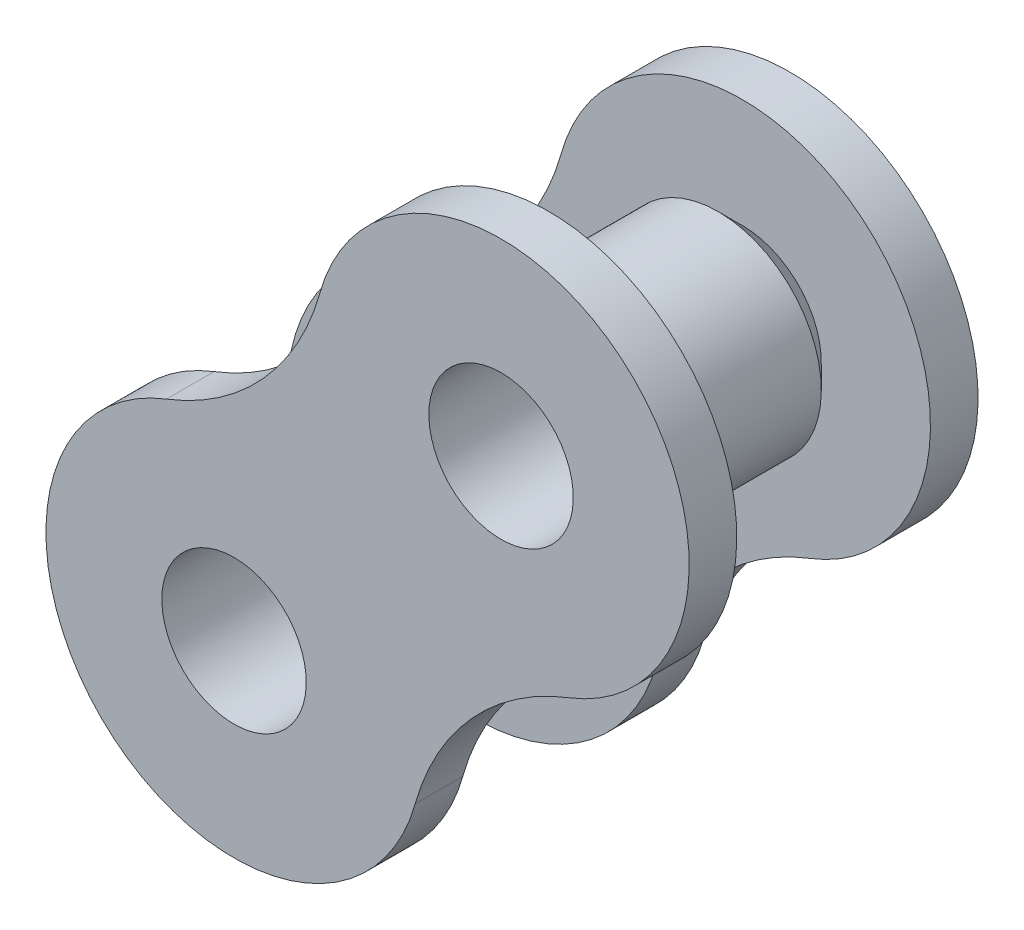
ISO-10303-21;
HEADER;
FILE_DESCRIPTION(('STEP AP214'),'2;1');
FILE_NAME('part.step','',(''),(''),'','','');
FILE_SCHEMA(('AUTOMOTIVE_DESIGN { 1 0 10303 214 1 1 1 1 }'));
ENDSEC;
DATA;
#1=APPLICATION_CONTEXT('core data for automotive mechanical design processes');
#2=APPLICATION_PROTOCOL_DEFINITION('international standard','automotive_design',2000,#1);
#3=PRODUCT_CONTEXT('',#1,'mechanical');
#4=PRODUCT('Part','Part','',(#3));
#5=PRODUCT_RELATED_PRODUCT_CATEGORY('part','',(#4));
#6=PRODUCT_DEFINITION_FORMATION('','',#4);
#7=PRODUCT_DEFINITION_CONTEXT('part definition',#1,'design');
#8=PRODUCT_DEFINITION('design','',#6,#7);
#9=PRODUCT_DEFINITION_SHAPE('','',#8);
#10=(LENGTH_UNIT() NAMED_UNIT(*) SI_UNIT(.MILLI.,.METRE.));
#11=(NAMED_UNIT(*) PLANE_ANGLE_UNIT() SI_UNIT($,.RADIAN.));
#12=(NAMED_UNIT(*) SI_UNIT($,.STERADIAN.) SOLID_ANGLE_UNIT());
#13=UNCERTAINTY_MEASURE_WITH_UNIT(LENGTH_MEASURE(1.E-05),#10,'distance_accuracy_value','');
#14=(GEOMETRIC_REPRESENTATION_CONTEXT(3) GLOBAL_UNCERTAINTY_ASSIGNED_CONTEXT((#13)) GLOBAL_UNIT_ASSIGNED_CONTEXT((#10,
#11,#12)) REPRESENTATION_CONTEXT('',''));
#15=CARTESIAN_POINT('',(0.,0.,0.));
#16=DIRECTION('',(0.,0.,1.));
#17=DIRECTION('',(1.,0.,0.));
#18=AXIS2_PLACEMENT_3D('',#15,#16,#17);
#19=CARTESIAN_POINT('',(89.4881503249085,918.494208741523,-128.5494));
#20=DIRECTION('',(0.,0.,-1.));
#21=DIRECTION('',(0.,-1.,0.));
#22=AXIS2_PLACEMENT_3D('',#19,#20,#21);
#23=PLANE('',#22);
#24=CARTESIAN_POINT('',(87.3517540658685,916.145499303479,-128.5494));
#25=DIRECTION('',(0.,0.,1.));
#26=DIRECTION('',(0.672880711508676,0.73975100410853,0.));
#27=AXIS2_PLACEMENT_3D('',#24,#25,#26);
#28=CIRCLE('',#27,3.0099);
#29=CARTESIAN_POINT('',(86.2709440464581,918.954653573351,-128.5494));
#30=VERTEX_POINT('',#29);
#31=CARTESIAN_POINT('',(90.2504434810805,915.334883683016,-128.5494));
#32=VERTEX_POINT('',#31);
#33=EDGE_CURVE('E212',#30,#32,#28,.T.);
#34=ORIENTED_EDGE('',*,*,#33,.T.);
#35=CARTESIAN_POINT('',(94.164911459126,914.240206594759,-128.5494));
#36=DIRECTION('',(0.,0.,1.));
#37=DIRECTION('',(0.672880711508676,0.73975100410853,0.));
#38=AXIS2_PLACEMENT_3D('',#35,#36,#37);
#39=CIRCLE('',#38,4.06464973628698);
#40=CARTESIAN_POINT('',(92.705356603359,918.033763909695,-128.5494));
#41=VERTEX_POINT('',#40);
#42=EDGE_CURVE('E227',#41,#32,#39,.T.);
#43=ORIENTED_EDGE('',*,*,#42,.F.);
#44=CARTESIAN_POINT('',(91.6245465839486,920.842918179568,-128.5494));
#45=DIRECTION('',(0.,0.,1.));
#46=DIRECTION('',(0.672880711508676,0.73975100410853,0.));
#47=AXIS2_PLACEMENT_3D('',#44,#45,#46);
#48=CIRCLE('',#47,3.0099);
#49=CARTESIAN_POINT('',(88.7258571687366,921.65353380003,-128.5494));
#50=VERTEX_POINT('',#49);
#51=EDGE_CURVE('E237',#41,#50,#48,.T.);
#52=ORIENTED_EDGE('',*,*,#51,.T.);
#53=CARTESIAN_POINT('',(84.8113891906911,922.748210888287,-128.5494));
#54=DIRECTION('',(0.,0.,1.));
#55=DIRECTION('',(0.672880711508676,0.73975100410853,0.));
#56=AXIS2_PLACEMENT_3D('',#53,#54,#55);
#57=CIRCLE('',#56,4.06464973628691);
#58=EDGE_CURVE('E20',#30,#50,#57,.T.);
#59=ORIENTED_EDGE('',*,*,#58,.F.);
#60=EDGE_LOOP('',(#34,#43,#52,#59));
#61=FACE_BOUND('',#60,.T.);
#62=CARTESIAN_POINT('',(91.6245465839486,920.842918179568,-128.5494));
#63=DIRECTION('',(0.,0.,1.));
#64=DIRECTION('',(0.672880711508676,0.73975100410853,0.));
#65=AXIS2_PLACEMENT_3D('',#62,#63,#64);
#66=CIRCLE('',#65,1.26365);
#67=CARTESIAN_POINT('',(92.4748322950465,921.77770453591,-128.5494));
#68=VERTEX_POINT('',#67);
#69=EDGE_CURVE('E209',#68,#68,#66,.T.);
#70=ORIENTED_EDGE('',*,*,#69,.F.);
#71=EDGE_LOOP('',(#70));
#72=FACE_BOUND('',#71,.T.);
#73=CARTESIAN_POINT('',(87.3517540658685,916.145499303479,-128.5494));
#74=DIRECTION('',(0.,0.,1.));
#75=DIRECTION('',(0.672880711508676,0.73975100410853,0.));
#76=AXIS2_PLACEMENT_3D('',#73,#74,#75);
#77=CIRCLE('',#76,1.26365);
#78=CARTESIAN_POINT('',(88.2020397769664,917.080285659821,-128.5494));
#79=VERTEX_POINT('',#78);
#80=EDGE_CURVE('E206',#79,#79,#77,.T.);
#81=ORIENTED_EDGE('',*,*,#80,.F.);
#82=EDGE_LOOP('',(#81));
#83=FACE_BOUND('',#82,.T.);
#84=ADVANCED_FACE('F17',(#61,#72,#83),#23,.F.);
#85=CARTESIAN_POINT('',(89.4881503249085,918.494208741523,-129.3114));
#86=DIRECTION('',(0.,0.,-1.));
#87=DIRECTION('',(0.,-1.,0.));
#88=AXIS2_PLACEMENT_3D('',#85,#86,#87);
#89=PLANE('',#88);
#90=CARTESIAN_POINT('',(87.3517540658685,916.145499303479,-129.3114));
#91=DIRECTION('',(0.,0.,1.));
#92=DIRECTION('',(0.672880711508676,0.73975100410853,0.));
#93=AXIS2_PLACEMENT_3D('',#90,#91,#92);
#94=CIRCLE('',#93,1.1557);
#95=CARTESIAN_POINT('',(88.1294023041591,917.000429538927,-129.3114));
#96=VERTEX_POINT('',#95);
#97=EDGE_CURVE('E580',#96,#96,#94,.T.);
#98=ORIENTED_EDGE('',*,*,#97,.T.);
#99=EDGE_LOOP('',(#98));
#100=FACE_BOUND('',#99,.T.);
#101=CARTESIAN_POINT('',(91.6245465839486,920.842918179568,-129.3114));
#102=DIRECTION('',(0.,0.,1.));
#103=DIRECTION('',(0.672880711508676,0.73975100410853,0.));
#104=AXIS2_PLACEMENT_3D('',#101,#102,#103);
#105=CIRCLE('',#104,1.1557);
#106=CARTESIAN_POINT('',(92.4021948222392,921.697848415016,-129.3114));
#107=VERTEX_POINT('',#106);
#108=EDGE_CURVE('E162',#107,#107,#105,.T.);
#109=ORIENTED_EDGE('',*,*,#108,.T.);
#110=EDGE_LOOP('',(#109));
#111=FACE_BOUND('',#110,.T.);
#112=CARTESIAN_POINT('',(87.3517540658685,916.145499303479,-129.3114));
#113=DIRECTION('',(0.,0.,1.));
#114=DIRECTION('',(0.672880711508676,0.73975100410853,0.));
#115=AXIS2_PLACEMENT_3D('',#112,#113,#114);
#116=CIRCLE('',#115,3.0099);
#117=CARTESIAN_POINT('',(86.2709440464581,918.954653573351,-129.3114));
#118=VERTEX_POINT('',#117);
#119=CARTESIAN_POINT('',(90.2504434810805,915.334883683016,-129.3114));
#120=VERTEX_POINT('',#119);
#121=EDGE_CURVE('E219',#118,#120,#116,.T.);
#122=ORIENTED_EDGE('',*,*,#121,.F.);
#123=CARTESIAN_POINT('',(84.8113891906911,922.748210888287,-129.3114));
#124=DIRECTION('',(0.,0.,1.));
#125=DIRECTION('',(0.672880711508676,0.73975100410853,0.));
#126=AXIS2_PLACEMENT_3D('',#123,#124,#125);
#127=CIRCLE('',#126,4.06464973628691);
#128=CARTESIAN_POINT('',(88.7258571687366,921.65353380003,-129.3114));
#129=VERTEX_POINT('',#128);
#130=EDGE_CURVE('E11',#118,#129,#127,.T.);
#131=ORIENTED_EDGE('',*,*,#130,.T.);
#132=CARTESIAN_POINT('',(91.6245465839486,920.842918179568,-129.3114));
#133=DIRECTION('',(0.,0.,1.));
#134=DIRECTION('',(0.672880711508676,0.73975100410853,0.));
#135=AXIS2_PLACEMENT_3D('',#132,#133,#134);
#136=CIRCLE('',#135,3.0099);
#137=CARTESIAN_POINT('',(92.705356603359,918.033763909695,-129.3114));
#138=VERTEX_POINT('',#137);
#139=EDGE_CURVE('E241',#138,#129,#136,.T.);
#140=ORIENTED_EDGE('',*,*,#139,.F.);
#141=CARTESIAN_POINT('',(94.164911459126,914.240206594759,-129.3114));
#142=DIRECTION('',(0.,0.,1.));
#143=DIRECTION('',(0.672880711508676,0.73975100410853,0.));
#144=AXIS2_PLACEMENT_3D('',#141,#142,#143);
#145=CIRCLE('',#144,4.06464973628698);
#146=EDGE_CURVE('E229',#138,#120,#145,.T.);
#147=ORIENTED_EDGE('',*,*,#146,.T.);
#148=EDGE_LOOP('',(#122,#131,#140,#147));
#149=FACE_BOUND('',#148,.T.);
#150=ADVANCED_FACE('F417',(#100,#111,#149),#89,.T.);
#151=CARTESIAN_POINT('',(84.8113891906911,922.748210888287,-129.3114));
#152=DIRECTION('',(0.,0.,1.));
#153=DIRECTION('',(-0.672880711508676,-0.73975100410853,0.));
#154=AXIS2_PLACEMENT_3D('',#151,#152,#153);
#155=CYLINDRICAL_SURFACE('',#154,4.06464973628691);
#156=ORIENTED_EDGE('',*,*,#58,.T.);
#157=DIRECTION('',(0.,0.,1.));
#158=VECTOR('',#157,1.);
#159=CARTESIAN_POINT('',(88.7258571687366,921.65353380003,-129.3114));
#160=LINE('',#159,#158);
#161=EDGE_CURVE('E244',#129,#50,#160,.T.);
#162=ORIENTED_EDGE('',*,*,#161,.F.);
#163=ORIENTED_EDGE('',*,*,#130,.F.);
#164=DIRECTION('',(0.,0.,1.));
#165=VECTOR('',#164,1.);
#166=CARTESIAN_POINT('',(86.2709440464581,918.954653573351,-129.3114));
#167=LINE('',#166,#165);
#168=EDGE_CURVE('E216',#118,#30,#167,.T.);
#169=ORIENTED_EDGE('',*,*,#168,.T.);
#170=EDGE_LOOP('',(#156,#162,#163,#169));
#171=FACE_BOUND('',#170,.T.);
#172=ADVANCED_FACE('F409',(#171),#155,.F.);
#173=CARTESIAN_POINT('',(91.6245465839486,920.842918179568,-129.3114));
#174=DIRECTION('',(0.,0.,1.));
#175=DIRECTION('',(-0.672880711508676,-0.73975100410853,0.));
#176=AXIS2_PLACEMENT_3D('',#173,#174,#175);
#177=CYLINDRICAL_SURFACE('',#176,3.0099);
#178=ORIENTED_EDGE('',*,*,#51,.F.);
#179=DIRECTION('',(0.,0.,1.));
#180=VECTOR('',#179,1.);
#181=CARTESIAN_POINT('',(92.705356603359,918.033763909695,-129.3114));
#182=LINE('',#181,#180);
#183=EDGE_CURVE('E233',#138,#41,#182,.T.);
#184=ORIENTED_EDGE('',*,*,#183,.F.);
#185=ORIENTED_EDGE('',*,*,#139,.T.);
#186=ORIENTED_EDGE('',*,*,#161,.T.);
#187=EDGE_LOOP('',(#178,#184,#185,#186));
#188=FACE_BOUND('',#187,.T.);
#189=ADVANCED_FACE('F393',(#188),#177,.T.);
#190=CARTESIAN_POINT('',(94.164911459126,914.240206594759,-129.3114));
#191=DIRECTION('',(0.,0.,1.));
#192=DIRECTION('',(-0.672880711508676,-0.73975100410853,0.));
#193=AXIS2_PLACEMENT_3D('',#190,#191,#192);
#194=CYLINDRICAL_SURFACE('',#193,4.06464973628698);
#195=ORIENTED_EDGE('',*,*,#42,.T.);
#196=DIRECTION('',(0.,0.,1.));
#197=VECTOR('',#196,1.);
#198=CARTESIAN_POINT('',(90.2504434810805,915.334883683016,-129.3114));
#199=LINE('',#198,#197);
#200=EDGE_CURVE('E223',#120,#32,#199,.T.);
#201=ORIENTED_EDGE('',*,*,#200,.F.);
#202=ORIENTED_EDGE('',*,*,#146,.F.);
#203=ORIENTED_EDGE('',*,*,#183,.T.);
#204=EDGE_LOOP('',(#195,#201,#202,#203));
#205=FACE_BOUND('',#204,.T.);
#206=ADVANCED_FACE('F388',(#205),#194,.F.);
#207=CARTESIAN_POINT('',(87.3517540658685,916.145499303479,-129.3114));
#208=DIRECTION('',(0.,0.,1.));
#209=DIRECTION('',(-0.672880711508676,-0.73975100410853,0.));
#210=AXIS2_PLACEMENT_3D('',#207,#208,#209);
#211=CYLINDRICAL_SURFACE('',#210,3.0099);
#212=ORIENTED_EDGE('',*,*,#33,.F.);
#213=ORIENTED_EDGE('',*,*,#168,.F.);
#214=ORIENTED_EDGE('',*,*,#121,.T.);
#215=ORIENTED_EDGE('',*,*,#200,.T.);
#216=EDGE_LOOP('',(#212,#213,#214,#215));
#217=FACE_BOUND('',#216,.T.);
#218=ADVANCED_FACE('F271',(#217),#211,.T.);
#219=CARTESIAN_POINT('',(91.6245465839486,920.842918179568,-128.5494));
#220=DIRECTION('',(0.,0.,1.));
#221=DIRECTION('',(-0.672880711508676,-0.73975100410853,0.));
#222=AXIS2_PLACEMENT_3D('',#219,#220,#221);
#223=CONICAL_SURFACE('',#222,1.26365,0.785398163397448);
#224=ORIENTED_EDGE('',*,*,#69,.T.);
#225=EDGE_LOOP('',(#224));
#226=FACE_BOUND('',#225,.T.);
#227=CARTESIAN_POINT('',(91.6245465839486,920.842918179568,-128.16205));
#228=DIRECTION('',(0.,0.,-1.));
#229=DIRECTION('',(0.672880711508676,0.73975100410853,0.));
#230=AXIS2_PLACEMENT_3D('',#227,#228,#229);
#231=CIRCLE('',#230,1.651);
#232=CARTESIAN_POINT('',(92.7354726386494,922.064247087351,-128.16205));
#233=VERTEX_POINT('',#232);
#234=EDGE_CURVE('E149',#233,#233,#231,.T.);
#235=ORIENTED_EDGE('',*,*,#234,.T.);
#236=EDGE_LOOP('',(#235));
#237=FACE_BOUND('',#236,.T.);
#238=ADVANCED_FACE('F150',(#226,#237),#223,.T.);
#239=CARTESIAN_POINT('',(87.3517540658685,916.145499303479,-128.5494));
#240=DIRECTION('',(0.,0.,1.));
#241=DIRECTION('',(-0.672880711508676,-0.73975100410853,0.));
#242=AXIS2_PLACEMENT_3D('',#239,#240,#241);
#243=CONICAL_SURFACE('',#242,1.26365,0.785398163397448);
#244=ORIENTED_EDGE('',*,*,#80,.T.);
#245=EDGE_LOOP('',(#244));
#246=FACE_BOUND('',#245,.T.);
#247=CARTESIAN_POINT('',(87.3517540658685,916.145499303479,-128.16205));
#248=DIRECTION('',(0.,0.,-1.));
#249=DIRECTION('',(0.672880711508676,0.73975100410853,0.));
#250=AXIS2_PLACEMENT_3D('',#247,#248,#249);
#251=CIRCLE('',#250,1.651);
#252=CARTESIAN_POINT('',(88.4626801205693,917.366828211262,-128.16205));
#253=VERTEX_POINT('',#252);
#254=EDGE_CURVE('E570',#253,#253,#251,.T.);
#255=ORIENTED_EDGE('',*,*,#254,.T.);
#256=EDGE_LOOP('',(#255));
#257=FACE_BOUND('',#256,.T.);
#258=ADVANCED_FACE('F270',(#246,#257),#243,.T.);
#259=CARTESIAN_POINT('',(89.4881503249085,918.494208741523,-125.4506));
#260=DIRECTION('',(0.,0.,1.));
#261=DIRECTION('',(1.,0.,0.));
#262=AXIS2_PLACEMENT_3D('',#259,#260,#261);
#263=PLANE('',#262);
#264=CARTESIAN_POINT('',(87.3517540658685,916.145499303479,-125.4506));
#265=DIRECTION('',(0.,0.,1.));
#266=DIRECTION('',(0.672880711508676,0.73975100410853,0.));
#267=AXIS2_PLACEMENT_3D('',#264,#265,#266);
#268=CIRCLE('',#267,3.0099);
#269=CARTESIAN_POINT('',(86.2709440464581,918.954653573351,-125.4506));
#270=VERTEX_POINT('',#269);
#271=CARTESIAN_POINT('',(90.2504434810805,915.334883683016,-125.4506));
#272=VERTEX_POINT('',#271);
#273=EDGE_CURVE('E160',#270,#272,#268,.T.);
#274=ORIENTED_EDGE('',*,*,#273,.F.);
#275=CARTESIAN_POINT('',(84.8113891906911,922.748210888287,-125.4506));
#276=DIRECTION('',(0.,0.,1.));
#277=DIRECTION('',(0.672880711508676,0.73975100410853,0.));
#278=AXIS2_PLACEMENT_3D('',#275,#276,#277);
#279=CIRCLE('',#278,4.06464973628691);
#280=CARTESIAN_POINT('',(88.7258571687366,921.65353380003,-125.4506));
#281=VERTEX_POINT('',#280);
#282=EDGE_CURVE('E200',#270,#281,#279,.T.);
#283=ORIENTED_EDGE('',*,*,#282,.T.);
#284=CARTESIAN_POINT('',(91.6245465839486,920.842918179568,-125.4506));
#285=DIRECTION('',(0.,0.,1.));
#286=DIRECTION('',(0.672880711508676,0.73975100410853,0.));
#287=AXIS2_PLACEMENT_3D('',#284,#285,#286);
#288=CIRCLE('',#287,3.0099);
#289=CARTESIAN_POINT('',(92.705356603359,918.033763909695,-125.4506));
#290=VERTEX_POINT('',#289);
#291=EDGE_CURVE('E188',#290,#281,#288,.T.);
#292=ORIENTED_EDGE('',*,*,#291,.F.);
#293=CARTESIAN_POINT('',(94.164911459126,914.240206594759,-125.4506));
#294=DIRECTION('',(0.,0.,1.));
#295=DIRECTION('',(0.672880711508676,0.73975100410853,0.));
#296=AXIS2_PLACEMENT_3D('',#293,#294,#295);
#297=CIRCLE('',#296,4.06464973628698);
#298=EDGE_CURVE('E177',#290,#272,#297,.T.);
#299=ORIENTED_EDGE('',*,*,#298,.T.);
#300=EDGE_LOOP('',(#274,#283,#292,#299));
#301=FACE_BOUND('',#300,.T.);
#302=CARTESIAN_POINT('',(91.6245465839486,920.842918179568,-125.4506));
#303=DIRECTION('',(0.,0.,1.));
#304=DIRECTION('',(0.672880711508676,0.73975100410853,0.));
#305=AXIS2_PLACEMENT_3D('',#302,#303,#304);
#306=CIRCLE('',#305,1.26365);
#307=CARTESIAN_POINT('',(92.4748322950465,921.77770453591,-125.4506));
#308=VERTEX_POINT('',#307);
#309=EDGE_CURVE('E153',#308,#308,#306,.T.);
#310=ORIENTED_EDGE('',*,*,#309,.T.);
#311=EDGE_LOOP('',(#310));
#312=FACE_BOUND('',#311,.T.);
#313=CARTESIAN_POINT('',(87.3517540658685,916.145499303479,-125.4506));
#314=DIRECTION('',(0.,0.,1.));
#315=DIRECTION('',(0.672880711508676,0.73975100410853,0.));
#316=AXIS2_PLACEMENT_3D('',#313,#314,#315);
#317=CIRCLE('',#316,1.26365);
#318=CARTESIAN_POINT('',(88.2020397769664,917.080285659821,-125.4506));
#319=VERTEX_POINT('',#318);
#320=EDGE_CURVE('E572',#319,#319,#317,.T.);
#321=ORIENTED_EDGE('',*,*,#320,.T.);
#322=EDGE_LOOP('',(#321));
#323=FACE_BOUND('',#322,.T.);
#324=ADVANCED_FACE('F350',(#301,#312,#323),#263,.F.);
#325=CARTESIAN_POINT('',(89.4881503249085,918.494208741523,-124.6886));
#326=DIRECTION('',(0.,0.,1.));
#327=DIRECTION('',(1.,0.,0.));
#328=AXIS2_PLACEMENT_3D('',#325,#326,#327);
#329=PLANE('',#328);
#330=CARTESIAN_POINT('',(87.3517540658685,916.145499303479,-124.6886));
#331=DIRECTION('',(0.,0.,1.));
#332=DIRECTION('',(0.672880711508676,0.73975100410853,0.));
#333=AXIS2_PLACEMENT_3D('',#330,#331,#332);
#334=CIRCLE('',#333,1.1557);
#335=CARTESIAN_POINT('',(88.1294023041591,917.000429538927,-124.6886));
#336=VERTEX_POINT('',#335);
#337=EDGE_CURVE('E606',#336,#336,#334,.T.);
#338=ORIENTED_EDGE('',*,*,#337,.F.);
#339=EDGE_LOOP('',(#338));
#340=FACE_BOUND('',#339,.T.);
#341=CARTESIAN_POINT('',(91.6245465839486,920.842918179568,-124.6886));
#342=DIRECTION('',(0.,0.,1.));
#343=DIRECTION('',(0.672880711508676,0.73975100410853,0.));
#344=AXIS2_PLACEMENT_3D('',#341,#342,#343);
#345=CIRCLE('',#344,1.1557);
#346=CARTESIAN_POINT('',(92.4021948222392,921.697848415016,-124.6886));
#347=VERTEX_POINT('',#346);
#348=EDGE_CURVE('E577',#347,#347,#345,.T.);
#349=ORIENTED_EDGE('',*,*,#348,.F.);
#350=EDGE_LOOP('',(#349));
#351=FACE_BOUND('',#350,.T.);
#352=CARTESIAN_POINT('',(87.3517540658685,916.145499303479,-124.6886));
#353=DIRECTION('',(0.,0.,1.));
#354=DIRECTION('',(0.672880711508676,0.73975100410853,0.));
#355=AXIS2_PLACEMENT_3D('',#352,#353,#354);
#356=CIRCLE('',#355,3.0099);
#357=CARTESIAN_POINT('',(86.2709440464581,918.954653573351,-124.6886));
#358=VERTEX_POINT('',#357);
#359=CARTESIAN_POINT('',(90.2504434810805,915.334883683016,-124.6886));
#360=VERTEX_POINT('',#359);
#361=EDGE_CURVE('E172',#358,#360,#356,.T.);
#362=ORIENTED_EDGE('',*,*,#361,.T.);
#363=CARTESIAN_POINT('',(94.164911459126,914.240206594759,-124.6886));
#364=DIRECTION('',(0.,0.,1.));
#365=DIRECTION('',(0.672880711508676,0.73975100410853,0.));
#366=AXIS2_PLACEMENT_3D('',#363,#364,#365);
#367=CIRCLE('',#366,4.06464973628698);
#368=CARTESIAN_POINT('',(92.705356603359,918.033763909695,-124.6886));
#369=VERTEX_POINT('',#368);
#370=EDGE_CURVE('E182',#369,#360,#367,.T.);
#371=ORIENTED_EDGE('',*,*,#370,.F.);
#372=CARTESIAN_POINT('',(91.6245465839486,920.842918179568,-124.6886));
#373=DIRECTION('',(0.,0.,1.));
#374=DIRECTION('',(0.672880711508676,0.73975100410853,0.));
#375=AXIS2_PLACEMENT_3D('',#372,#373,#374);
#376=CIRCLE('',#375,3.0099);
#377=CARTESIAN_POINT('',(88.7258571687366,921.65353380003,-124.6886));
#378=VERTEX_POINT('',#377);
#379=EDGE_CURVE('E196',#369,#378,#376,.T.);
#380=ORIENTED_EDGE('',*,*,#379,.T.);
#381=CARTESIAN_POINT('',(84.8113891906911,922.748210888287,-124.6886));
#382=DIRECTION('',(0.,0.,1.));
#383=DIRECTION('',(0.672880711508676,0.73975100410853,0.));
#384=AXIS2_PLACEMENT_3D('',#381,#382,#383);
#385=CIRCLE('',#384,4.06464973628691);
#386=EDGE_CURVE('E203',#358,#378,#385,.T.);
#387=ORIENTED_EDGE('',*,*,#386,.F.);
#388=EDGE_LOOP('',(#362,#371,#380,#387));
#389=FACE_BOUND('',#388,.T.);
#390=ADVANCED_FACE('F295',(#340,#351,#389),#329,.T.);
#391=CARTESIAN_POINT('',(84.8113891906911,922.748210888287,-124.6886));
#392=DIRECTION('',(0.,0.,-1.));
#393=DIRECTION('',(-0.672880711508676,-0.73975100410853,0.));
#394=AXIS2_PLACEMENT_3D('',#391,#392,#393);
#395=CYLINDRICAL_SURFACE('',#394,4.06464973628691);
#396=ORIENTED_EDGE('',*,*,#282,.F.);
#397=DIRECTION('',(0.,0.,-1.));
#398=VECTOR('',#397,1.);
#399=CARTESIAN_POINT('',(86.2709440464581,918.954653573351,-124.6886));
#400=LINE('',#399,#398);
#401=EDGE_CURVE('E173',#358,#270,#400,.T.);
#402=ORIENTED_EDGE('',*,*,#401,.F.);
#403=ORIENTED_EDGE('',*,*,#386,.T.);
#404=DIRECTION('',(0.,0.,-1.));
#405=VECTOR('',#404,1.);
#406=CARTESIAN_POINT('',(88.7258571687366,921.65353380003,-124.6886));
#407=LINE('',#406,#405);
#408=EDGE_CURVE('E192',#378,#281,#407,.T.);
#409=ORIENTED_EDGE('',*,*,#408,.T.);
#410=EDGE_LOOP('',(#396,#402,#403,#409));
#411=FACE_BOUND('',#410,.T.);
#412=ADVANCED_FACE('F289',(#411),#395,.F.);
#413=CARTESIAN_POINT('',(91.6245465839486,920.842918179568,-124.6886));
#414=DIRECTION('',(0.,0.,-1.));
#415=DIRECTION('',(-0.672880711508676,-0.73975100410853,0.));
#416=AXIS2_PLACEMENT_3D('',#413,#414,#415);
#417=CYLINDRICAL_SURFACE('',#416,3.0099);
#418=ORIENTED_EDGE('',*,*,#291,.T.);
#419=ORIENTED_EDGE('',*,*,#408,.F.);
#420=ORIENTED_EDGE('',*,*,#379,.F.);
#421=DIRECTION('',(0.,0.,-1.));
#422=VECTOR('',#421,1.);
#423=CARTESIAN_POINT('',(92.705356603359,918.033763909695,-124.6886));
#424=LINE('',#423,#422);
#425=EDGE_CURVE('E178',#369,#290,#424,.T.);
#426=ORIENTED_EDGE('',*,*,#425,.T.);
#427=EDGE_LOOP('',(#418,#419,#420,#426));
#428=FACE_BOUND('',#427,.T.);
#429=ADVANCED_FACE('F294',(#428),#417,.T.);
#430=CARTESIAN_POINT('',(94.164911459126,914.240206594759,-124.6886));
#431=DIRECTION('',(0.,0.,-1.));
#432=DIRECTION('',(-0.672880711508676,-0.73975100410853,0.));
#433=AXIS2_PLACEMENT_3D('',#430,#431,#432);
#434=CYLINDRICAL_SURFACE('',#433,4.06464973628698);
#435=ORIENTED_EDGE('',*,*,#298,.F.);
#436=ORIENTED_EDGE('',*,*,#425,.F.);
#437=ORIENTED_EDGE('',*,*,#370,.T.);
#438=DIRECTION('',(0.,0.,-1.));
#439=VECTOR('',#438,1.);
#440=CARTESIAN_POINT('',(90.2504434810805,915.334883683016,-124.6886));
#441=LINE('',#440,#439);
#442=EDGE_CURVE('E168',#360,#272,#441,.T.);
#443=ORIENTED_EDGE('',*,*,#442,.T.);
#444=EDGE_LOOP('',(#435,#436,#437,#443));
#445=FACE_BOUND('',#444,.T.);
#446=ADVANCED_FACE('F341',(#445),#434,.F.);
#447=CARTESIAN_POINT('',(87.3517540658685,916.145499303479,-124.6886));
#448=DIRECTION('',(0.,0.,-1.));
#449=DIRECTION('',(-0.672880711508676,-0.73975100410853,0.));
#450=AXIS2_PLACEMENT_3D('',#447,#448,#449);
#451=CYLINDRICAL_SURFACE('',#450,3.0099);
#452=ORIENTED_EDGE('',*,*,#273,.T.);
#453=ORIENTED_EDGE('',*,*,#442,.F.);
#454=ORIENTED_EDGE('',*,*,#361,.F.);
#455=ORIENTED_EDGE('',*,*,#401,.T.);
#456=EDGE_LOOP('',(#452,#453,#454,#455));
#457=FACE_BOUND('',#456,.T.);
#458=ADVANCED_FACE('F334',(#457),#451,.T.);
#459=CARTESIAN_POINT('',(91.6245465839486,920.842918179568,-125.4506));
#460=DIRECTION('',(0.,0.,-1.));
#461=DIRECTION('',(-0.672880711508676,-0.73975100410853,0.));
#462=AXIS2_PLACEMENT_3D('',#459,#460,#461);
#463=CONICAL_SURFACE('',#462,1.26365,0.785398163397448);
#464=ORIENTED_EDGE('',*,*,#309,.F.);
#465=EDGE_LOOP('',(#464));
#466=FACE_BOUND('',#465,.T.);
#467=CARTESIAN_POINT('',(91.6245465839486,920.842918179568,-125.83795));
#468=DIRECTION('',(0.,0.,-1.));
#469=DIRECTION('',(0.672880711508676,0.73975100410853,0.));
#470=AXIS2_PLACEMENT_3D('',#467,#468,#469);
#471=CIRCLE('',#470,1.651);
#472=CARTESIAN_POINT('',(92.7354726386494,922.064247087351,-125.83795));
#473=VERTEX_POINT('',#472);
#474=EDGE_CURVE('E154',#473,#473,#471,.T.);
#475=ORIENTED_EDGE('',*,*,#474,.F.);
#476=EDGE_LOOP('',(#475));
#477=FACE_BOUND('',#476,.T.);
#478=ADVANCED_FACE('F325',(#466,#477),#463,.T.);
#479=CARTESIAN_POINT('',(91.6245465839486,920.842918179568,-125.4506));
#480=DIRECTION('',(0.,0.,-1.));
#481=DIRECTION('',(-0.672880711508676,-0.73975100410853,0.));
#482=AXIS2_PLACEMENT_3D('',#479,#480,#481);
#483=CYLINDRICAL_SURFACE('',#482,1.651);
#484=ORIENTED_EDGE('',*,*,#234,.F.);
#485=EDGE_LOOP('',(#484));
#486=FACE_BOUND('',#485,.T.);
#487=ORIENTED_EDGE('',*,*,#474,.T.);
#488=EDGE_LOOP('',(#487));
#489=FACE_BOUND('',#488,.T.);
#490=ADVANCED_FACE('F307',(#486,#489),#483,.T.);
#491=CARTESIAN_POINT('',(91.6245465839486,920.842918179568,-125.4506));
#492=DIRECTION('',(0.,0.,-1.));
#493=DIRECTION('',(-0.672880711508676,-0.73975100410853,0.));
#494=AXIS2_PLACEMENT_3D('',#491,#492,#493);
#495=CYLINDRICAL_SURFACE('',#494,1.1557);
#496=ORIENTED_EDGE('',*,*,#108,.F.);
#497=EDGE_LOOP('',(#496));
#498=FACE_BOUND('',#497,.T.);
#499=ORIENTED_EDGE('',*,*,#348,.T.);
#500=EDGE_LOOP('',(#499));
#501=FACE_BOUND('',#500,.T.);
#502=ADVANCED_FACE('F302',(#498,#501),#495,.F.);
#503=CARTESIAN_POINT('',(87.3517540658685,916.145499303479,-125.4506));
#504=DIRECTION('',(0.,0.,-1.));
#505=DIRECTION('',(-0.672880711508676,-0.73975100410853,0.));
#506=AXIS2_PLACEMENT_3D('',#503,#504,#505);
#507=CONICAL_SURFACE('',#506,1.26365,0.785398163397448);
#508=ORIENTED_EDGE('',*,*,#320,.F.);
#509=EDGE_LOOP('',(#508));
#510=FACE_BOUND('',#509,.T.);
#511=CARTESIAN_POINT('',(87.3517540658685,916.145499303479,-125.83795));
#512=DIRECTION('',(0.,0.,-1.));
#513=DIRECTION('',(0.672880711508676,0.73975100410853,0.));
#514=AXIS2_PLACEMENT_3D('',#511,#512,#513);
#515=CIRCLE('',#514,1.651);
#516=CARTESIAN_POINT('',(88.4626801205693,917.366828211262,-125.83795));
#517=VERTEX_POINT('',#516);
#518=EDGE_CURVE('E573',#517,#517,#515,.T.);
#519=ORIENTED_EDGE('',*,*,#518,.F.);
#520=EDGE_LOOP('',(#519));
#521=FACE_BOUND('',#520,.T.);
#522=ADVANCED_FACE('F282',(#510,#521),#507,.T.);
#523=CARTESIAN_POINT('',(87.3517540658685,916.145499303479,-125.4506));
#524=DIRECTION('',(0.,0.,-1.));
#525=DIRECTION('',(-0.672880711508676,-0.73975100410853,0.));
#526=AXIS2_PLACEMENT_3D('',#523,#524,#525);
#527=CYLINDRICAL_SURFACE('',#526,1.651);
#528=ORIENTED_EDGE('',*,*,#254,.F.);
#529=EDGE_LOOP('',(#528));
#530=FACE_BOUND('',#529,.T.);
#531=ORIENTED_EDGE('',*,*,#518,.T.);
#532=EDGE_LOOP('',(#531));
#533=FACE_BOUND('',#532,.T.);
#534=ADVANCED_FACE('F258',(#530,#533),#527,.T.);
#535=CARTESIAN_POINT('',(87.3517540658685,916.145499303479,-125.4506));
#536=DIRECTION('',(0.,0.,-1.));
#537=DIRECTION('',(-0.672880711508676,-0.73975100410853,0.));
#538=AXIS2_PLACEMENT_3D('',#535,#536,#537);
#539=CYLINDRICAL_SURFACE('',#538,1.1557);
#540=ORIENTED_EDGE('',*,*,#97,.F.);
#541=EDGE_LOOP('',(#540));
#542=FACE_BOUND('',#541,.T.);
#543=ORIENTED_EDGE('',*,*,#337,.T.);
#544=EDGE_LOOP('',(#543));
#545=FACE_BOUND('',#544,.T.);
#546=ADVANCED_FACE('F253',(#542,#545),#539,.F.);
#547=CLOSED_SHELL('',(#84,#150,#172,#189,#206,#218,#238,#258,#324,#390,#412,#429,#446,#458,#478,
#490,#502,#522,#534,#546));
#548=MANIFOLD_SOLID_BREP('B1',#547);
#549=ADVANCED_BREP_SHAPE_REPRESENTATION('',(#18,#548),#14);
#550=SHAPE_DEFINITION_REPRESENTATION(#9,#549);
ENDSEC;
END-ISO-10303-21;
